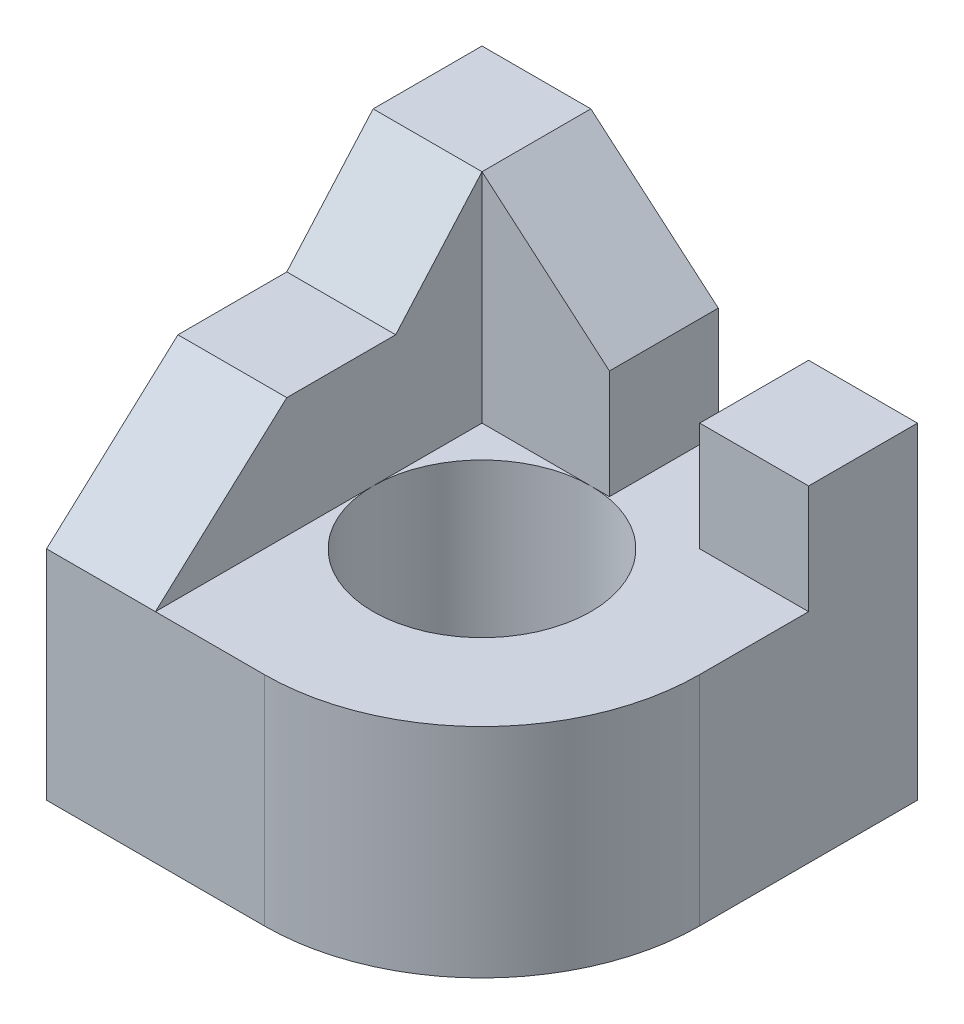
ISO-10303-21;
HEADER;
FILE_DESCRIPTION(('STEP AP214'),'2;1');
FILE_NAME('part.step','',(''),(''),'','','');
FILE_SCHEMA(('AUTOMOTIVE_DESIGN { 1 0 10303 214 1 1 1 1 }'));
ENDSEC;
DATA;
#1=APPLICATION_CONTEXT('core data for automotive mechanical design processes');
#2=APPLICATION_PROTOCOL_DEFINITION('international standard','automotive_design',2000,#1);
#3=PRODUCT_CONTEXT('',#1,'mechanical');
#4=PRODUCT('Part','Part','',(#3));
#5=PRODUCT_RELATED_PRODUCT_CATEGORY('part','',(#4));
#6=PRODUCT_DEFINITION_FORMATION('','',#4);
#7=PRODUCT_DEFINITION_CONTEXT('part definition',#1,'design');
#8=PRODUCT_DEFINITION('design','',#6,#7);
#9=PRODUCT_DEFINITION_SHAPE('','',#8);
#10=(LENGTH_UNIT() NAMED_UNIT(*) SI_UNIT(.MILLI.,.METRE.));
#11=(NAMED_UNIT(*) PLANE_ANGLE_UNIT() SI_UNIT($,.RADIAN.));
#12=(NAMED_UNIT(*) SI_UNIT($,.STERADIAN.) SOLID_ANGLE_UNIT());
#13=UNCERTAINTY_MEASURE_WITH_UNIT(LENGTH_MEASURE(1.E-05),#10,'distance_accuracy_value','');
#14=(GEOMETRIC_REPRESENTATION_CONTEXT(3) GLOBAL_UNCERTAINTY_ASSIGNED_CONTEXT((#13)) GLOBAL_UNIT_ASSIGNED_CONTEXT((#10,
#11,#12)) REPRESENTATION_CONTEXT('',''));
#15=CARTESIAN_POINT('',(0.,0.,0.));
#16=DIRECTION('',(0.,0.,1.));
#17=DIRECTION('',(1.,0.,0.));
#18=AXIS2_PLACEMENT_3D('',#15,#16,#17);
#19=CARTESIAN_POINT('',(2.,2.,2.));
#20=DIRECTION('',(0.,-1.,0.));
#21=DIRECTION('',(0.,0.,-1.));
#22=AXIS2_PLACEMENT_3D('',#19,#20,#21);
#23=PLANE('',#22);
#24=DIRECTION('',(-1.,0.,0.));
#25=VECTOR('',#24,1.);
#26=CARTESIAN_POINT('',(1.48690172013778,2.,1.));
#27=LINE('',#26,#25);
#28=CARTESIAN_POINT('',(2.17058510559242,2.,1.));
#29=VERTEX_POINT('',#28);
#30=CARTESIAN_POINT('',(2.,2.,1.));
#31=VERTEX_POINT('',#30);
#32=EDGE_CURVE('E153',#29,#31,#27,.T.);
#33=ORIENTED_EDGE('',*,*,#32,.T.);
#34=CARTESIAN_POINT('',(2.,2.,2.));
#35=DIRECTION('',(0.,1.,0.));
#36=DIRECTION('',(0.,0.,1.));
#37=AXIS2_PLACEMENT_3D('',#34,#35,#36);
#38=CIRCLE('',#37,1.);
#39=CARTESIAN_POINT('',(1.,2.,2.));
#40=VERTEX_POINT('',#39);
#41=EDGE_CURVE('E50',#40,#31,#38,.T.);
#42=ORIENTED_EDGE('',*,*,#41,.F.);
#43=DIRECTION('',(0.,0.,1.));
#44=VECTOR('',#43,1.);
#45=CARTESIAN_POINT('',(1.,2.,4.));
#46=LINE('',#45,#44);
#47=CARTESIAN_POINT('',(1.,2.,4.));
#48=VERTEX_POINT('',#47);
#49=EDGE_CURVE('E151',#40,#48,#46,.T.);
#50=ORIENTED_EDGE('',*,*,#49,.T.);
#51=DIRECTION('',(1.,0.,0.));
#52=VECTOR('',#51,1.);
#53=CARTESIAN_POINT('',(0.,2.,4.));
#54=LINE('',#53,#52);
#55=CARTESIAN_POINT('',(1.99999999999999,2.,4.));
#56=VERTEX_POINT('',#55);
#57=EDGE_CURVE('E246',#48,#56,#54,.T.);
#58=ORIENTED_EDGE('',*,*,#57,.T.);
#59=CARTESIAN_POINT('',(2.,2.,2.));
#60=DIRECTION('',(0.,1.,0.));
#61=DIRECTION('',(0.,0.,-1.));
#62=AXIS2_PLACEMENT_3D('',#59,#60,#61);
#63=CIRCLE('',#62,2.);
#64=CARTESIAN_POINT('',(4.,2.,1.99999999999999));
#65=VERTEX_POINT('',#64);
#66=EDGE_CURVE('E245',#56,#65,#63,.T.);
#67=ORIENTED_EDGE('',*,*,#66,.T.);
#68=DIRECTION('',(0.,0.,-1.));
#69=VECTOR('',#68,1.);
#70=CARTESIAN_POINT('',(4.,2.,0.));
#71=LINE('',#70,#69);
#72=CARTESIAN_POINT('',(4.,2.,1.));
#73=VERTEX_POINT('',#72);
#74=EDGE_CURVE('E248',#65,#73,#71,.T.);
#75=ORIENTED_EDGE('',*,*,#74,.T.);
#76=DIRECTION('',(-1.,0.,0.));
#77=VECTOR('',#76,1.);
#78=CARTESIAN_POINT('',(3.,2.,1.));
#79=LINE('',#78,#77);
#80=CARTESIAN_POINT('',(3.,2.,1.));
#81=VERTEX_POINT('',#80);
#82=EDGE_CURVE('E217',#73,#81,#79,.T.);
#83=ORIENTED_EDGE('',*,*,#82,.T.);
#84=DIRECTION('',(0.,0.,-1.));
#85=VECTOR('',#84,1.);
#86=CARTESIAN_POINT('',(3.,2.,1.));
#87=LINE('',#86,#85);
#88=CARTESIAN_POINT('',(3.,2.,0.));
#89=VERTEX_POINT('',#88);
#90=EDGE_CURVE('E230',#81,#89,#87,.T.);
#91=ORIENTED_EDGE('',*,*,#90,.T.);
#92=DIRECTION('',(-1.,0.,0.));
#93=VECTOR('',#92,1.);
#94=CARTESIAN_POINT('',(0.,2.,0.));
#95=LINE('',#94,#93);
#96=CARTESIAN_POINT('',(2.17058510559242,2.,0.));
#97=VERTEX_POINT('',#96);
#98=EDGE_CURVE('E251',#89,#97,#95,.T.);
#99=ORIENTED_EDGE('',*,*,#98,.T.);
#100=DIRECTION('',(0.,0.,-1.));
#101=VECTOR('',#100,1.);
#102=CARTESIAN_POINT('',(2.17058510559242,2.,1.));
#103=LINE('',#102,#101);
#104=EDGE_CURVE('E58',#29,#97,#103,.T.);
#105=ORIENTED_EDGE('',*,*,#104,.F.);
#106=EDGE_LOOP('',(#33,#42,#50,#58,#67,#75,#83,#91,#99,#105));
#107=FACE_BOUND('',#106,.T.);
#108=ADVANCED_FACE('F35',(#107),#23,.F.);
#109=CARTESIAN_POINT('',(0.,2.,0.));
#110=DIRECTION('',(1.,0.,0.));
#111=DIRECTION('',(0.,0.,-1.));
#112=AXIS2_PLACEMENT_3D('',#109,#110,#111);
#113=PLANE('',#112);
#114=DIRECTION('',(0.,-1.,0.));
#115=VECTOR('',#114,1.);
#116=CARTESIAN_POINT('',(0.,2.,4.));
#117=LINE('',#116,#115);
#118=CARTESIAN_POINT('',(0.,2.,4.));
#119=VERTEX_POINT('',#118);
#120=CARTESIAN_POINT('',(0.,0.,4.));
#121=VERTEX_POINT('',#120);
#122=EDGE_CURVE('E11',#119,#121,#117,.T.);
#123=ORIENTED_EDGE('',*,*,#122,.F.);
#124=DIRECTION('',(0.,0.673373867835069,-0.739302126411685));
#125=VECTOR('',#124,1.);
#126=CARTESIAN_POINT('',(0.,3.09933245635897,2.79303480363359));
#127=LINE('',#126,#125);
#128=CARTESIAN_POINT('',(0.,3.09933245635897,2.79303480363359));
#129=VERTEX_POINT('',#128);
#130=EDGE_CURVE('E178',#119,#129,#127,.T.);
#131=ORIENTED_EDGE('',*,*,#130,.T.);
#132=DIRECTION('',(0.,0.,-1.));
#133=VECTOR('',#132,1.);
#134=CARTESIAN_POINT('',(0.,3.09933245635897,1.79303480363359));
#135=LINE('',#134,#133);
#136=CARTESIAN_POINT('',(0.,3.09933245635897,1.79303480363359));
#137=VERTEX_POINT('',#136);
#138=EDGE_CURVE('E181',#129,#137,#135,.T.);
#139=ORIENTED_EDGE('',*,*,#138,.T.);
#140=DIRECTION('',(0.,0.750528604896275,-0.660837962917122));
#141=VECTOR('',#140,1.);
#142=CARTESIAN_POINT('',(0.,4.,1.));
#143=LINE('',#142,#141);
#144=CARTESIAN_POINT('',(0.,4.,1.));
#145=VERTEX_POINT('',#144);
#146=EDGE_CURVE('E184',#137,#145,#143,.T.);
#147=ORIENTED_EDGE('',*,*,#146,.T.);
#148=DIRECTION('',(0.,0.,-1.));
#149=VECTOR('',#148,1.);
#150=CARTESIAN_POINT('',(0.,4.,1.));
#151=LINE('',#150,#149);
#152=CARTESIAN_POINT('',(0.,4.,0.));
#153=VERTEX_POINT('',#152);
#154=EDGE_CURVE('E200',#145,#153,#151,.T.);
#155=ORIENTED_EDGE('',*,*,#154,.T.);
#156=DIRECTION('',(0.,-1.,0.));
#157=VECTOR('',#156,1.);
#158=CARTESIAN_POINT('',(0.,2.,0.));
#159=LINE('',#158,#157);
#160=CARTESIAN_POINT('',(0.,0.,0.));
#161=VERTEX_POINT('',#160);
#162=EDGE_CURVE('E253',#153,#161,#159,.T.);
#163=ORIENTED_EDGE('',*,*,#162,.T.);
#164=DIRECTION('',(0.,0.,1.));
#165=VECTOR('',#164,1.);
#166=CARTESIAN_POINT('',(0.,0.,0.));
#167=LINE('',#166,#165);
#168=EDGE_CURVE('E238',#161,#121,#167,.T.);
#169=ORIENTED_EDGE('',*,*,#168,.T.);
#170=EDGE_LOOP('',(#123,#131,#139,#147,#155,#163,#169));
#171=FACE_BOUND('',#170,.T.);
#172=ADVANCED_FACE('F37',(#171),#113,.F.);
#173=CARTESIAN_POINT('',(0.,2.,4.));
#174=DIRECTION('',(0.,0.,-1.));
#175=DIRECTION('',(-1.,0.,0.));
#176=AXIS2_PLACEMENT_3D('',#173,#174,#175);
#177=PLANE('',#176);
#178=DIRECTION('',(1.,0.,0.));
#179=VECTOR('',#178,1.);
#180=CARTESIAN_POINT('',(0.,0.,4.));
#181=LINE('',#180,#179);
#182=CARTESIAN_POINT('',(1.99999999999999,0.,4.));
#183=VERTEX_POINT('',#182);
#184=EDGE_CURVE('E256',#121,#183,#181,.T.);
#185=ORIENTED_EDGE('',*,*,#184,.T.);
#186=DIRECTION('',(0.,-1.,0.));
#187=VECTOR('',#186,1.);
#188=CARTESIAN_POINT('',(1.99999999999999,2.,4.));
#189=LINE('',#188,#187);
#190=EDGE_CURVE('E44',#56,#183,#189,.T.);
#191=ORIENTED_EDGE('',*,*,#190,.F.);
#192=ORIENTED_EDGE('',*,*,#57,.F.);
#193=EDGE_CURVE('E243',#119,#48,#54,.T.);
#194=ORIENTED_EDGE('',*,*,#193,.F.);
#195=ORIENTED_EDGE('',*,*,#122,.T.);
#196=EDGE_LOOP('',(#185,#191,#192,#194,#195));
#197=FACE_BOUND('',#196,.T.);
#198=ADVANCED_FACE('F298',(#197),#177,.F.);
#199=CARTESIAN_POINT('',(2.,2.,2.));
#200=DIRECTION('',(0.,-1.,0.));
#201=DIRECTION('',(0.,0.,-1.));
#202=AXIS2_PLACEMENT_3D('',#199,#200,#201);
#203=CYLINDRICAL_SURFACE('',#202,2.);
#204=CARTESIAN_POINT('',(2.,0.,2.));
#205=DIRECTION('',(0.,1.,0.));
#206=DIRECTION('',(0.,0.,-1.));
#207=AXIS2_PLACEMENT_3D('',#204,#205,#206);
#208=CIRCLE('',#207,2.);
#209=CARTESIAN_POINT('',(4.,0.,1.99999999999999));
#210=VERTEX_POINT('',#209);
#211=EDGE_CURVE('E258',#183,#210,#208,.T.);
#212=ORIENTED_EDGE('',*,*,#211,.T.);
#213=DIRECTION('',(0.,-1.,0.));
#214=VECTOR('',#213,1.);
#215=CARTESIAN_POINT('',(4.,2.,1.99999999999999));
#216=LINE('',#215,#214);
#217=EDGE_CURVE('E269',#65,#210,#216,.T.);
#218=ORIENTED_EDGE('',*,*,#217,.F.);
#219=ORIENTED_EDGE('',*,*,#66,.F.);
#220=ORIENTED_EDGE('',*,*,#190,.T.);
#221=EDGE_LOOP('',(#212,#218,#219,#220));
#222=FACE_BOUND('',#221,.T.);
#223=ADVANCED_FACE('F277',(#222),#203,.T.);
#224=CARTESIAN_POINT('',(4.,2.,0.));
#225=DIRECTION('',(-1.,0.,0.));
#226=DIRECTION('',(0.,0.,1.));
#227=AXIS2_PLACEMENT_3D('',#224,#225,#226);
#228=PLANE('',#227);
#229=DIRECTION('',(0.,0.,-1.));
#230=VECTOR('',#229,1.);
#231=CARTESIAN_POINT('',(4.,0.,0.));
#232=LINE('',#231,#230);
#233=CARTESIAN_POINT('',(4.,0.,0.));
#234=VERTEX_POINT('',#233);
#235=EDGE_CURVE('E260',#210,#234,#232,.T.);
#236=ORIENTED_EDGE('',*,*,#235,.T.);
#237=DIRECTION('',(0.,-1.,0.));
#238=VECTOR('',#237,1.);
#239=CARTESIAN_POINT('',(4.,2.,0.));
#240=LINE('',#239,#238);
#241=CARTESIAN_POINT('',(4.,3.,0.));
#242=VERTEX_POINT('',#241);
#243=EDGE_CURVE('E266',#242,#234,#240,.T.);
#244=ORIENTED_EDGE('',*,*,#243,.F.);
#245=DIRECTION('',(0.,0.,-1.));
#246=VECTOR('',#245,1.);
#247=CARTESIAN_POINT('',(4.,3.,1.));
#248=LINE('',#247,#246);
#249=CARTESIAN_POINT('',(4.,3.,1.));
#250=VERTEX_POINT('',#249);
#251=EDGE_CURVE('E235',#250,#242,#248,.T.);
#252=ORIENTED_EDGE('',*,*,#251,.F.);
#253=DIRECTION('',(0.,-1.,0.));
#254=VECTOR('',#253,1.);
#255=CARTESIAN_POINT('',(4.,2.,1.));
#256=LINE('',#255,#254);
#257=EDGE_CURVE('E227',#250,#73,#256,.T.);
#258=ORIENTED_EDGE('',*,*,#257,.T.);
#259=ORIENTED_EDGE('',*,*,#74,.F.);
#260=ORIENTED_EDGE('',*,*,#217,.T.);
#261=EDGE_LOOP('',(#236,#244,#252,#258,#259,#260));
#262=FACE_BOUND('',#261,.T.);
#263=ADVANCED_FACE('F286',(#262),#228,.F.);
#264=CARTESIAN_POINT('',(0.,2.,0.));
#265=DIRECTION('',(0.,0.,1.));
#266=DIRECTION('',(1.,0.,0.));
#267=AXIS2_PLACEMENT_3D('',#264,#265,#266);
#268=PLANE('',#267);
#269=DIRECTION('',(-1.,0.,0.));
#270=VECTOR('',#269,1.);
#271=CARTESIAN_POINT('',(0.,0.,0.));
#272=LINE('',#271,#270);
#273=EDGE_CURVE('E262',#234,#161,#272,.T.);
#274=ORIENTED_EDGE('',*,*,#273,.T.);
#275=ORIENTED_EDGE('',*,*,#162,.F.);
#276=DIRECTION('',(1.,0.,0.));
#277=VECTOR('',#276,1.);
#278=CARTESIAN_POINT('',(0.,4.,0.));
#279=LINE('',#278,#277);
#280=CARTESIAN_POINT('',(1.,4.,0.));
#281=VERTEX_POINT('',#280);
#282=EDGE_CURVE('E188',#153,#281,#279,.T.);
#283=ORIENTED_EDGE('',*,*,#282,.T.);
#284=DIRECTION('',(0.7603335087951,-0.649532874767191,0.));
#285=VECTOR('',#284,1.);
#286=CARTESIAN_POINT('',(1.,4.,0.));
#287=LINE('',#286,#285);
#288=CARTESIAN_POINT('',(2.17058510559242,3.,0.));
#289=VERTEX_POINT('',#288);
#290=EDGE_CURVE('E203',#281,#289,#287,.T.);
#291=ORIENTED_EDGE('',*,*,#290,.T.);
#292=DIRECTION('',(0.,-1.,0.));
#293=VECTOR('',#292,1.);
#294=CARTESIAN_POINT('',(2.17058510559242,3.,0.));
#295=LINE('',#294,#293);
#296=EDGE_CURVE('E206',#289,#97,#295,.T.);
#297=ORIENTED_EDGE('',*,*,#296,.T.);
#298=ORIENTED_EDGE('',*,*,#98,.F.);
#299=DIRECTION('',(0.,1.,0.));
#300=VECTOR('',#299,1.);
#301=CARTESIAN_POINT('',(3.,3.,0.));
#302=LINE('',#301,#300);
#303=CARTESIAN_POINT('',(3.,3.,0.));
#304=VERTEX_POINT('',#303);
#305=EDGE_CURVE('E210',#89,#304,#302,.T.);
#306=ORIENTED_EDGE('',*,*,#305,.T.);
#307=DIRECTION('',(1.,0.,0.));
#308=VECTOR('',#307,1.);
#309=CARTESIAN_POINT('',(4.,3.,0.));
#310=LINE('',#309,#308);
#311=EDGE_CURVE('E221',#304,#242,#310,.T.);
#312=ORIENTED_EDGE('',*,*,#311,.T.);
#313=ORIENTED_EDGE('',*,*,#243,.T.);
#314=EDGE_LOOP('',(#274,#275,#283,#291,#297,#298,#306,#312,#313));
#315=FACE_BOUND('',#314,.T.);
#316=ADVANCED_FACE('F289',(#315),#268,.F.);
#317=CARTESIAN_POINT('',(1.,2.,1.));
#318=VERTEX_POINT('',#317);
#319=EDGE_CURVE('E158',#318,#40,#46,.T.);
#320=ORIENTED_EDGE('',*,*,#319,.T.);
#321=EDGE_CURVE('E144',#31,#40,#38,.T.);
#322=ORIENTED_EDGE('',*,*,#321,.F.);
#323=EDGE_CURVE('E167',#31,#318,#27,.T.);
#324=ORIENTED_EDGE('',*,*,#323,.T.);
#325=EDGE_LOOP('',(#320,#322,#324));
#326=FACE_BOUND('',#325,.T.);
#327=ADVANCED_FACE('F166',(#326),#23,.F.);
#328=CARTESIAN_POINT('',(2.,0.,2.));
#329=DIRECTION('',(0.,-1.,0.));
#330=DIRECTION('',(0.,0.,-1.));
#331=AXIS2_PLACEMENT_3D('',#328,#329,#330);
#332=PLANE('',#331);
#333=CARTESIAN_POINT('',(2.,0.,2.));
#334=DIRECTION('',(0.,-1.,0.));
#335=DIRECTION('',(0.,0.,-1.));
#336=AXIS2_PLACEMENT_3D('',#333,#334,#335);
#337=CIRCLE('',#336,1.);
#338=CARTESIAN_POINT('',(2.,0.,1.));
#339=VERTEX_POINT('',#338);
#340=EDGE_CURVE('E39',#339,#339,#337,.T.);
#341=ORIENTED_EDGE('',*,*,#340,.F.);
#342=EDGE_LOOP('',(#341));
#343=FACE_BOUND('',#342,.T.);
#344=ORIENTED_EDGE('',*,*,#168,.F.);
#345=ORIENTED_EDGE('',*,*,#273,.F.);
#346=ORIENTED_EDGE('',*,*,#235,.F.);
#347=ORIENTED_EDGE('',*,*,#211,.F.);
#348=ORIENTED_EDGE('',*,*,#184,.F.);
#349=EDGE_LOOP('',(#344,#345,#346,#347,#348));
#350=FACE_BOUND('',#349,.T.);
#351=ADVANCED_FACE('F283',(#343,#350),#332,.T.);
#352=CARTESIAN_POINT('',(4.,3.,1.));
#353=DIRECTION('',(0.,1.,0.));
#354=DIRECTION('',(0.,0.,1.));
#355=AXIS2_PLACEMENT_3D('',#352,#353,#354);
#356=PLANE('',#355);
#357=ORIENTED_EDGE('',*,*,#311,.F.);
#358=DIRECTION('',(0.,0.,-1.));
#359=VECTOR('',#358,1.);
#360=CARTESIAN_POINT('',(3.,3.,1.));
#361=LINE('',#360,#359);
#362=CARTESIAN_POINT('',(3.,3.,1.));
#363=VERTEX_POINT('',#362);
#364=EDGE_CURVE('E239',#363,#304,#361,.T.);
#365=ORIENTED_EDGE('',*,*,#364,.F.);
#366=DIRECTION('',(1.,0.,0.));
#367=VECTOR('',#366,1.);
#368=CARTESIAN_POINT('',(4.,3.,1.));
#369=LINE('',#368,#367);
#370=EDGE_CURVE('E224',#363,#250,#369,.T.);
#371=ORIENTED_EDGE('',*,*,#370,.T.);
#372=ORIENTED_EDGE('',*,*,#251,.T.);
#373=EDGE_LOOP('',(#357,#365,#371,#372));
#374=FACE_BOUND('',#373,.T.);
#375=ADVANCED_FACE('F293',(#374),#356,.T.);
#376=CARTESIAN_POINT('',(3.,3.,1.));
#377=DIRECTION('',(-1.,0.,0.));
#378=DIRECTION('',(0.,0.,1.));
#379=AXIS2_PLACEMENT_3D('',#376,#377,#378);
#380=PLANE('',#379);
#381=ORIENTED_EDGE('',*,*,#305,.F.);
#382=ORIENTED_EDGE('',*,*,#90,.F.);
#383=DIRECTION('',(0.,1.,0.));
#384=VECTOR('',#383,1.);
#385=CARTESIAN_POINT('',(3.,3.,1.));
#386=LINE('',#385,#384);
#387=EDGE_CURVE('E220',#81,#363,#386,.T.);
#388=ORIENTED_EDGE('',*,*,#387,.T.);
#389=ORIENTED_EDGE('',*,*,#364,.T.);
#390=EDGE_LOOP('',(#381,#382,#388,#389));
#391=FACE_BOUND('',#390,.T.);
#392=ADVANCED_FACE('F318',(#391),#380,.T.);
#393=CARTESIAN_POINT('',(0.,0.,1.));
#394=DIRECTION('',(0.,0.,1.));
#395=DIRECTION('',(1.,0.,0.));
#396=AXIS2_PLACEMENT_3D('',#393,#394,#395);
#397=PLANE('',#396);
#398=ORIENTED_EDGE('',*,*,#82,.F.);
#399=ORIENTED_EDGE('',*,*,#257,.F.);
#400=ORIENTED_EDGE('',*,*,#370,.F.);
#401=ORIENTED_EDGE('',*,*,#387,.F.);
#402=EDGE_LOOP('',(#398,#399,#400,#401));
#403=FACE_BOUND('',#402,.T.);
#404=ADVANCED_FACE('F319',(#403),#397,.T.);
#405=CARTESIAN_POINT('',(2.17058510559242,3.,1.));
#406=DIRECTION('',(1.,0.,0.));
#407=DIRECTION('',(0.,0.,-1.));
#408=AXIS2_PLACEMENT_3D('',#405,#406,#407);
#409=PLANE('',#408);
#410=ORIENTED_EDGE('',*,*,#296,.F.);
#411=DIRECTION('',(0.,0.,-1.));
#412=VECTOR('',#411,1.);
#413=CARTESIAN_POINT('',(2.17058510559242,3.,1.));
#414=LINE('',#413,#412);
#415=CARTESIAN_POINT('',(2.17058510559242,3.,1.));
#416=VERTEX_POINT('',#415);
#417=EDGE_CURVE('E211',#416,#289,#414,.T.);
#418=ORIENTED_EDGE('',*,*,#417,.F.);
#419=DIRECTION('',(0.,-1.,0.));
#420=VECTOR('',#419,1.);
#421=CARTESIAN_POINT('',(2.17058510559242,3.,1.));
#422=LINE('',#421,#420);
#423=EDGE_CURVE('E197',#416,#29,#422,.T.);
#424=ORIENTED_EDGE('',*,*,#423,.T.);
#425=ORIENTED_EDGE('',*,*,#104,.T.);
#426=EDGE_LOOP('',(#410,#418,#424,#425));
#427=FACE_BOUND('',#426,.T.);
#428=ADVANCED_FACE('F315',(#427),#409,.T.);
#429=CARTESIAN_POINT('',(1.,4.,1.));
#430=DIRECTION('',(0.649532874767191,0.7603335087951,0.));
#431=DIRECTION('',(-0.7603335087951,0.649532874767191,0.));
#432=AXIS2_PLACEMENT_3D('',#429,#430,#431);
#433=PLANE('',#432);
#434=ORIENTED_EDGE('',*,*,#290,.F.);
#435=DIRECTION('',(0.,0.,-1.));
#436=VECTOR('',#435,1.);
#437=CARTESIAN_POINT('',(1.,4.,1.));
#438=LINE('',#437,#436);
#439=CARTESIAN_POINT('',(1.,4.,1.));
#440=VERTEX_POINT('',#439);
#441=EDGE_CURVE('E213',#440,#281,#438,.T.);
#442=ORIENTED_EDGE('',*,*,#441,.F.);
#443=DIRECTION('',(0.7603335087951,-0.649532874767191,0.));
#444=VECTOR('',#443,1.);
#445=CARTESIAN_POINT('',(1.,4.,1.));
#446=LINE('',#445,#444);
#447=EDGE_CURVE('E194',#440,#416,#446,.T.);
#448=ORIENTED_EDGE('',*,*,#447,.T.);
#449=ORIENTED_EDGE('',*,*,#417,.T.);
#450=EDGE_LOOP('',(#434,#442,#448,#449));
#451=FACE_BOUND('',#450,.T.);
#452=ADVANCED_FACE('F311',(#451),#433,.T.);
#453=CARTESIAN_POINT('',(0.,4.,1.));
#454=DIRECTION('',(0.,1.,0.));
#455=DIRECTION('',(0.,0.,1.));
#456=AXIS2_PLACEMENT_3D('',#453,#454,#455);
#457=PLANE('',#456);
#458=ORIENTED_EDGE('',*,*,#282,.F.);
#459=ORIENTED_EDGE('',*,*,#154,.F.);
#460=DIRECTION('',(1.,0.,0.));
#461=VECTOR('',#460,1.);
#462=CARTESIAN_POINT('',(0.,4.,1.));
#463=LINE('',#462,#461);
#464=EDGE_CURVE('E191',#145,#440,#463,.T.);
#465=ORIENTED_EDGE('',*,*,#464,.T.);
#466=ORIENTED_EDGE('',*,*,#441,.T.);
#467=EDGE_LOOP('',(#458,#459,#465,#466));
#468=FACE_BOUND('',#467,.T.);
#469=ADVANCED_FACE('F306',(#468),#457,.T.);
#470=CARTESIAN_POINT('',(0.,0.,1.));
#471=DIRECTION('',(0.,0.,-1.));
#472=DIRECTION('',(-1.,0.,0.));
#473=AXIS2_PLACEMENT_3D('',#470,#471,#472);
#474=PLANE('',#473);
#475=ORIENTED_EDGE('',*,*,#447,.F.);
#476=DIRECTION('',(0.,-1.,0.));
#477=VECTOR('',#476,1.);
#478=CARTESIAN_POINT('',(1.,2.,1.));
#479=LINE('',#478,#477);
#480=EDGE_CURVE('E164',#440,#318,#479,.T.);
#481=ORIENTED_EDGE('',*,*,#480,.T.);
#482=ORIENTED_EDGE('',*,*,#323,.F.);
#483=ORIENTED_EDGE('',*,*,#32,.F.);
#484=ORIENTED_EDGE('',*,*,#423,.F.);
#485=EDGE_LOOP('',(#475,#481,#482,#483,#484));
#486=FACE_BOUND('',#485,.T.);
#487=ADVANCED_FACE('F409',(#486),#474,.F.);
#488=CARTESIAN_POINT('',(1.,4.,1.));
#489=DIRECTION('',(0.,0.660837962917122,0.750528604896275));
#490=DIRECTION('',(0.,-0.750528604896275,0.660837962917122));
#491=AXIS2_PLACEMENT_3D('',#488,#489,#490);
#492=PLANE('',#491);
#493=ORIENTED_EDGE('',*,*,#146,.F.);
#494=DIRECTION('',(-1.,0.,0.));
#495=VECTOR('',#494,1.);
#496=CARTESIAN_POINT('',(1.,3.09933245635897,1.79303480363359));
#497=LINE('',#496,#495);
#498=CARTESIAN_POINT('',(1.,3.09933245635897,1.79303480363359));
#499=VERTEX_POINT('',#498);
#500=EDGE_CURVE('E186',#499,#137,#497,.T.);
#501=ORIENTED_EDGE('',*,*,#500,.F.);
#502=DIRECTION('',(0.,0.750528604896275,-0.660837962917122));
#503=VECTOR('',#502,1.);
#504=CARTESIAN_POINT('',(1.,4.,1.));
#505=LINE('',#504,#503);
#506=EDGE_CURVE('E174',#499,#440,#505,.T.);
#507=ORIENTED_EDGE('',*,*,#506,.T.);
#508=ORIENTED_EDGE('',*,*,#464,.F.);
#509=EDGE_LOOP('',(#493,#501,#507,#508));
#510=FACE_BOUND('',#509,.T.);
#511=ADVANCED_FACE('F414',(#510),#492,.T.);
#512=CARTESIAN_POINT('',(1.,3.09933245635897,1.79303480363359));
#513=DIRECTION('',(0.,1.,0.));
#514=DIRECTION('',(0.,0.,1.));
#515=AXIS2_PLACEMENT_3D('',#512,#513,#514);
#516=PLANE('',#515);
#517=ORIENTED_EDGE('',*,*,#138,.F.);
#518=DIRECTION('',(-1.,0.,0.));
#519=VECTOR('',#518,1.);
#520=CARTESIAN_POINT('',(1.,3.09933245635897,2.79303480363359));
#521=LINE('',#520,#519);
#522=CARTESIAN_POINT('',(1.,3.09933245635897,2.79303480363359));
#523=VERTEX_POINT('',#522);
#524=EDGE_CURVE('E177',#523,#129,#521,.T.);
#525=ORIENTED_EDGE('',*,*,#524,.F.);
#526=DIRECTION('',(0.,0.,-1.));
#527=VECTOR('',#526,1.);
#528=CARTESIAN_POINT('',(1.,3.09933245635897,1.79303480363359));
#529=LINE('',#528,#527);
#530=EDGE_CURVE('E168',#523,#499,#529,.T.);
#531=ORIENTED_EDGE('',*,*,#530,.T.);
#532=ORIENTED_EDGE('',*,*,#500,.T.);
#533=EDGE_LOOP('',(#517,#525,#531,#532));
#534=FACE_BOUND('',#533,.T.);
#535=ADVANCED_FACE('F420',(#534),#516,.T.);
#536=CARTESIAN_POINT('',(1.,3.09933245635897,2.79303480363359));
#537=DIRECTION('',(0.,0.739302126411685,0.673373867835069));
#538=DIRECTION('',(0.,-0.673373867835069,0.739302126411685));
#539=AXIS2_PLACEMENT_3D('',#536,#537,#538);
#540=PLANE('',#539);
#541=ORIENTED_EDGE('',*,*,#130,.F.);
#542=ORIENTED_EDGE('',*,*,#193,.T.);
#543=DIRECTION('',(0.,0.673373867835069,-0.739302126411685));
#544=VECTOR('',#543,1.);
#545=CARTESIAN_POINT('',(1.,3.09933245635897,2.79303480363359));
#546=LINE('',#545,#544);
#547=EDGE_CURVE('E162',#48,#523,#546,.T.);
#548=ORIENTED_EDGE('',*,*,#547,.T.);
#549=ORIENTED_EDGE('',*,*,#524,.T.);
#550=EDGE_LOOP('',(#541,#542,#548,#549));
#551=FACE_BOUND('',#550,.T.);
#552=ADVANCED_FACE('F430',(#551),#540,.T.);
#553=CARTESIAN_POINT('',(1.,0.,0.));
#554=DIRECTION('',(1.,0.,0.));
#555=DIRECTION('',(0.,0.,-1.));
#556=AXIS2_PLACEMENT_3D('',#553,#554,#555);
#557=PLANE('',#556);
#558=ORIENTED_EDGE('',*,*,#480,.F.);
#559=ORIENTED_EDGE('',*,*,#506,.F.);
#560=ORIENTED_EDGE('',*,*,#530,.F.);
#561=ORIENTED_EDGE('',*,*,#547,.F.);
#562=ORIENTED_EDGE('',*,*,#49,.F.);
#563=ORIENTED_EDGE('',*,*,#319,.F.);
#564=EDGE_LOOP('',(#558,#559,#560,#561,#562,#563));
#565=FACE_BOUND('',#564,.T.);
#566=ADVANCED_FACE('F157',(#565),#557,.T.);
#567=CARTESIAN_POINT('',(2.,-1.,2.));
#568=DIRECTION('',(0.,1.,0.));
#569=DIRECTION('',(0.,0.,1.));
#570=AXIS2_PLACEMENT_3D('',#567,#568,#569);
#571=CYLINDRICAL_SURFACE('',#570,1.);
#572=ORIENTED_EDGE('',*,*,#340,.T.);
#573=EDGE_LOOP('',(#572));
#574=FACE_BOUND('',#573,.T.);
#575=ORIENTED_EDGE('',*,*,#321,.T.);
#576=ORIENTED_EDGE('',*,*,#41,.T.);
#577=EDGE_LOOP('',(#575,#576));
#578=FACE_BOUND('',#577,.T.);
#579=ADVANCED_FACE('F145',(#574,#578),#571,.F.);
#580=CLOSED_SHELL('',(#108,#172,#198,#223,#263,#316,#327,#351,#375,#392,#404,#428,#452,#469,
#487,#511,#535,#552,#566,#579));
#581=MANIFOLD_SOLID_BREP('B2',#580);
#582=ADVANCED_BREP_SHAPE_REPRESENTATION('',(#18,#581),#14);
#583=SHAPE_DEFINITION_REPRESENTATION(#9,#582);
ENDSEC;
END-ISO-10303-21;
